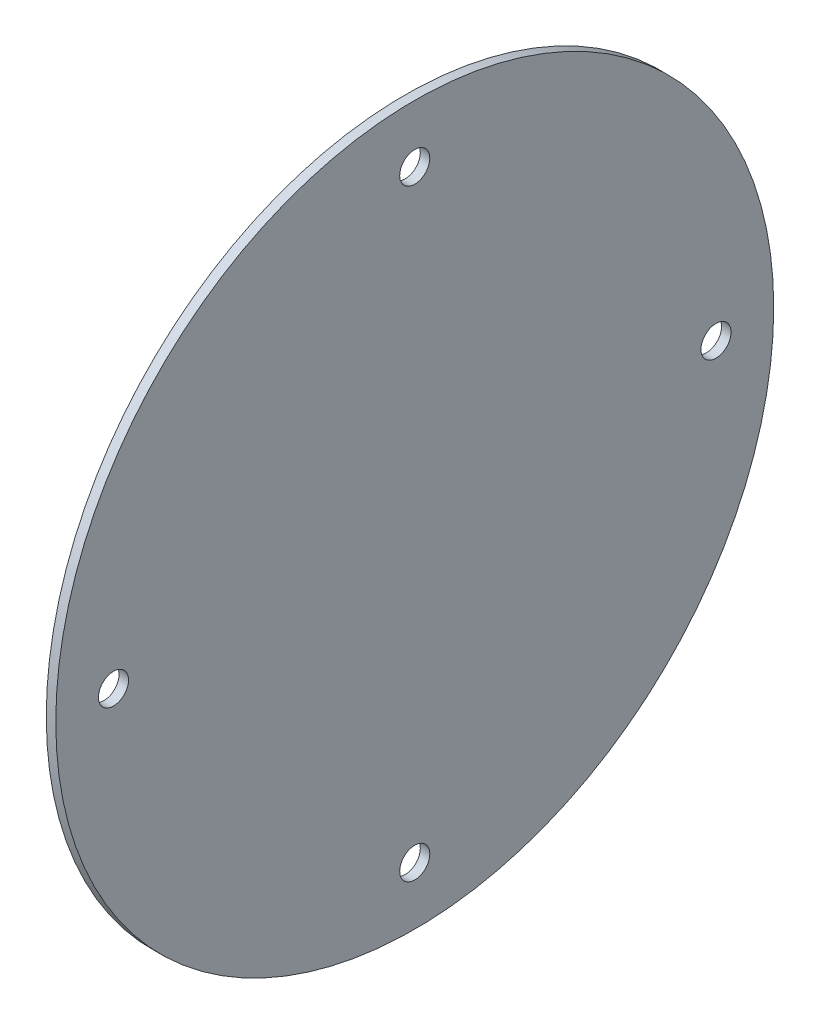
ISO-10303-21;
HEADER;
FILE_DESCRIPTION(('STEP AP214'),'2;1');
FILE_NAME('part.step','',(''),(''),'','','');
FILE_SCHEMA(('AUTOMOTIVE_DESIGN { 1 0 10303 214 1 1 1 1 }'));
ENDSEC;
DATA;
#1=APPLICATION_CONTEXT('core data for automotive mechanical design processes');
#2=APPLICATION_PROTOCOL_DEFINITION('international standard','automotive_design',2000,#1);
#3=PRODUCT_CONTEXT('',#1,'mechanical');
#4=PRODUCT('Part','Part','',(#3));
#5=PRODUCT_RELATED_PRODUCT_CATEGORY('part','',(#4));
#6=PRODUCT_DEFINITION_FORMATION('','',#4);
#7=PRODUCT_DEFINITION_CONTEXT('part definition',#1,'design');
#8=PRODUCT_DEFINITION('design','',#6,#7);
#9=PRODUCT_DEFINITION_SHAPE('','',#8);
#10=(LENGTH_UNIT() NAMED_UNIT(*) SI_UNIT(.MILLI.,.METRE.));
#11=(NAMED_UNIT(*) PLANE_ANGLE_UNIT() SI_UNIT($,.RADIAN.));
#12=(NAMED_UNIT(*) SI_UNIT($,.STERADIAN.) SOLID_ANGLE_UNIT());
#13=UNCERTAINTY_MEASURE_WITH_UNIT(LENGTH_MEASURE(1.E-05),#10,'distance_accuracy_value','');
#14=(GEOMETRIC_REPRESENTATION_CONTEXT(3) GLOBAL_UNCERTAINTY_ASSIGNED_CONTEXT((#13)) GLOBAL_UNIT_ASSIGNED_CONTEXT((#10,
#11,#12)) REPRESENTATION_CONTEXT('',''));
#15=CARTESIAN_POINT('',(0.,0.,0.));
#16=DIRECTION('',(0.,0.,1.));
#17=DIRECTION('',(1.,0.,0.));
#18=AXIS2_PLACEMENT_3D('',#15,#16,#17);
#19=CARTESIAN_POINT('',(2.0066,0.,0.));
#20=DIRECTION('',(-1.,0.,0.));
#21=DIRECTION('',(0.,0.,1.));
#22=AXIS2_PLACEMENT_3D('',#19,#20,#21);
#23=CYLINDRICAL_SURFACE('',#22,75.819);
#24=CARTESIAN_POINT('',(2.0066,0.,0.));
#25=DIRECTION('',(1.,0.,0.));
#26=DIRECTION('',(0.,0.,-1.));
#27=AXIS2_PLACEMENT_3D('',#24,#25,#26);
#28=CIRCLE('',#27,75.819);
#29=CARTESIAN_POINT('',(2.0066,0.,-75.819));
#30=VERTEX_POINT('',#29);
#31=EDGE_CURVE('E10',#30,#30,#28,.T.);
#32=ORIENTED_EDGE('',*,*,#31,.F.);
#33=EDGE_LOOP('',(#32));
#34=FACE_BOUND('',#33,.T.);
#35=CARTESIAN_POINT('',(0.,0.,0.));
#36=DIRECTION('',(1.,0.,0.));
#37=DIRECTION('',(0.,0.,-1.));
#38=AXIS2_PLACEMENT_3D('',#35,#36,#37);
#39=CIRCLE('',#38,75.819);
#40=CARTESIAN_POINT('',(0.,0.,-75.819));
#41=VERTEX_POINT('',#40);
#42=EDGE_CURVE('E45',#41,#41,#39,.T.);
#43=ORIENTED_EDGE('',*,*,#42,.T.);
#44=EDGE_LOOP('',(#43));
#45=FACE_BOUND('',#44,.T.);
#46=ADVANCED_FACE('F42',(#34,#45),#23,.T.);
#47=CARTESIAN_POINT('',(2.0066,0.,0.));
#48=DIRECTION('',(1.,0.,0.));
#49=DIRECTION('',(0.,0.,-1.));
#50=AXIS2_PLACEMENT_3D('',#47,#48,#49);
#51=PLANE('',#50);
#52=CARTESIAN_POINT('',(2.0066,-63.627,-2.23645572524093E-13));
#53=DIRECTION('',(-1.,0.,0.));
#54=DIRECTION('',(0.,-1.,0.));
#55=AXIS2_PLACEMENT_3D('',#52,#53,#54);
#56=CIRCLE('',#55,3.175);
#57=CARTESIAN_POINT('',(2.0066,-66.802,-2.34731025774919E-13));
#58=VERTEX_POINT('',#57);
#59=EDGE_CURVE('E60',#58,#58,#56,.T.);
#60=ORIENTED_EDGE('',*,*,#59,.T.);
#61=EDGE_LOOP('',(#60));
#62=FACE_BOUND('',#61,.T.);
#63=CARTESIAN_POINT('',(2.0066,0.,-63.627));
#64=DIRECTION('',(-1.,0.,0.));
#65=DIRECTION('',(0.,0.,-1.));
#66=AXIS2_PLACEMENT_3D('',#63,#64,#65);
#67=CIRCLE('',#66,3.175);
#68=CARTESIAN_POINT('',(2.0066,0.,-66.802));
#69=VERTEX_POINT('',#68);
#70=EDGE_CURVE('E76',#69,#69,#67,.T.);
#71=ORIENTED_EDGE('',*,*,#70,.T.);
#72=EDGE_LOOP('',(#71));
#73=FACE_BOUND('',#72,.T.);
#74=CARTESIAN_POINT('',(2.0066,63.627,6.67950538817237E-13));
#75=DIRECTION('',(-1.,0.,0.));
#76=DIRECTION('',(0.,1.,0.));
#77=AXIS2_PLACEMENT_3D('',#74,#75,#76);
#78=CIRCLE('',#77,3.175);
#79=CARTESIAN_POINT('',(2.0066,66.802,7.01206898569718E-13));
#80=VERTEX_POINT('',#79);
#81=EDGE_CURVE('E68',#80,#80,#78,.T.);
#82=ORIENTED_EDGE('',*,*,#81,.T.);
#83=EDGE_LOOP('',(#82));
#84=FACE_BOUND('',#83,.T.);
#85=CARTESIAN_POINT('',(2.0066,0.,63.627));
#86=DIRECTION('',(-1.,0.,0.));
#87=DIRECTION('',(0.,0.,1.));
#88=AXIS2_PLACEMENT_3D('',#85,#86,#87);
#89=CIRCLE('',#88,3.175);
#90=CARTESIAN_POINT('',(2.0066,0.,66.802));
#91=VERTEX_POINT('',#90);
#92=EDGE_CURVE('E54',#91,#91,#89,.T.);
#93=ORIENTED_EDGE('',*,*,#92,.T.);
#94=EDGE_LOOP('',(#93));
#95=FACE_BOUND('',#94,.T.);
#96=ORIENTED_EDGE('',*,*,#31,.T.);
#97=EDGE_LOOP('',(#96));
#98=FACE_BOUND('',#97,.T.);
#99=ADVANCED_FACE('F88',(#62,#73,#84,#95,#98),#51,.T.);
#100=CARTESIAN_POINT('',(0.,0.,0.));
#101=DIRECTION('',(1.,0.,0.));
#102=DIRECTION('',(0.,0.,-1.));
#103=AXIS2_PLACEMENT_3D('',#100,#101,#102);
#104=PLANE('',#103);
#105=CARTESIAN_POINT('',(0.,-63.627,-2.23645572524093E-13));
#106=DIRECTION('',(-1.,0.,0.));
#107=DIRECTION('',(0.,-1.,0.));
#108=AXIS2_PLACEMENT_3D('',#105,#106,#107);
#109=CIRCLE('',#108,3.175);
#110=CARTESIAN_POINT('',(0.,-66.802,-2.34731025774919E-13));
#111=VERTEX_POINT('',#110);
#112=EDGE_CURVE('E80',#111,#111,#109,.T.);
#113=ORIENTED_EDGE('',*,*,#112,.F.);
#114=EDGE_LOOP('',(#113));
#115=FACE_BOUND('',#114,.T.);
#116=CARTESIAN_POINT('',(0.,0.,-63.627));
#117=DIRECTION('',(-1.,0.,0.));
#118=DIRECTION('',(0.,0.,-1.));
#119=AXIS2_PLACEMENT_3D('',#116,#117,#118);
#120=CIRCLE('',#119,3.175);
#121=CARTESIAN_POINT('',(0.,0.,-66.802));
#122=VERTEX_POINT('',#121);
#123=EDGE_CURVE('E72',#122,#122,#120,.T.);
#124=ORIENTED_EDGE('',*,*,#123,.F.);
#125=EDGE_LOOP('',(#124));
#126=FACE_BOUND('',#125,.T.);
#127=CARTESIAN_POINT('',(0.,63.627,6.67950538817237E-13));
#128=DIRECTION('',(-1.,0.,0.));
#129=DIRECTION('',(0.,1.,0.));
#130=AXIS2_PLACEMENT_3D('',#127,#128,#129);
#131=CIRCLE('',#130,3.175);
#132=CARTESIAN_POINT('',(0.,66.802,7.01206898569718E-13));
#133=VERTEX_POINT('',#132);
#134=EDGE_CURVE('E64',#133,#133,#131,.T.);
#135=ORIENTED_EDGE('',*,*,#134,.F.);
#136=EDGE_LOOP('',(#135));
#137=FACE_BOUND('',#136,.T.);
#138=CARTESIAN_POINT('',(0.,0.,63.627));
#139=DIRECTION('',(-1.,0.,0.));
#140=DIRECTION('',(0.,0.,1.));
#141=AXIS2_PLACEMENT_3D('',#138,#139,#140);
#142=CIRCLE('',#141,3.175);
#143=CARTESIAN_POINT('',(0.,0.,66.802));
#144=VERTEX_POINT('',#143);
#145=EDGE_CURVE('E56',#144,#144,#142,.T.);
#146=ORIENTED_EDGE('',*,*,#145,.F.);
#147=EDGE_LOOP('',(#146));
#148=FACE_BOUND('',#147,.T.);
#149=ORIENTED_EDGE('',*,*,#42,.F.);
#150=EDGE_LOOP('',(#149));
#151=FACE_BOUND('',#150,.T.);
#152=ADVANCED_FACE('F98',(#115,#126,#137,#148,#151),#104,.F.);
#153=CARTESIAN_POINT('',(2.0066,0.,63.627));
#154=DIRECTION('',(-1.,0.,0.));
#155=DIRECTION('',(0.,0.,1.));
#156=AXIS2_PLACEMENT_3D('',#153,#154,#155);
#157=CYLINDRICAL_SURFACE('',#156,3.175);
#158=ORIENTED_EDGE('',*,*,#92,.F.);
#159=EDGE_LOOP('',(#158));
#160=FACE_BOUND('',#159,.T.);
#161=ORIENTED_EDGE('',*,*,#145,.T.);
#162=EDGE_LOOP('',(#161));
#163=FACE_BOUND('',#162,.T.);
#164=ADVANCED_FACE('F101',(#160,#163),#157,.F.);
#165=CARTESIAN_POINT('',(2.0066,63.627,6.67950538817237E-13));
#166=DIRECTION('',(-1.,0.,0.));
#167=DIRECTION('',(0.,0.,1.));
#168=AXIS2_PLACEMENT_3D('',#165,#166,#167);
#169=CYLINDRICAL_SURFACE('',#168,3.175);
#170=ORIENTED_EDGE('',*,*,#81,.F.);
#171=EDGE_LOOP('',(#170));
#172=FACE_BOUND('',#171,.T.);
#173=ORIENTED_EDGE('',*,*,#134,.T.);
#174=EDGE_LOOP('',(#173));
#175=FACE_BOUND('',#174,.T.);
#176=ADVANCED_FACE('F121',(#172,#175),#169,.F.);
#177=CARTESIAN_POINT('',(2.0066,0.,-63.627));
#178=DIRECTION('',(-1.,0.,0.));
#179=DIRECTION('',(0.,0.,1.));
#180=AXIS2_PLACEMENT_3D('',#177,#178,#179);
#181=CYLINDRICAL_SURFACE('',#180,3.175);
#182=ORIENTED_EDGE('',*,*,#70,.F.);
#183=EDGE_LOOP('',(#182));
#184=FACE_BOUND('',#183,.T.);
#185=ORIENTED_EDGE('',*,*,#123,.T.);
#186=EDGE_LOOP('',(#185));
#187=FACE_BOUND('',#186,.T.);
#188=ADVANCED_FACE('F94',(#184,#187),#181,.F.);
#189=CARTESIAN_POINT('',(2.0066,-63.627,-2.23645572524093E-13));
#190=DIRECTION('',(-1.,0.,0.));
#191=DIRECTION('',(0.,0.,1.));
#192=AXIS2_PLACEMENT_3D('',#189,#190,#191);
#193=CYLINDRICAL_SURFACE('',#192,3.175);
#194=ORIENTED_EDGE('',*,*,#59,.F.);
#195=EDGE_LOOP('',(#194));
#196=FACE_BOUND('',#195,.T.);
#197=ORIENTED_EDGE('',*,*,#112,.T.);
#198=EDGE_LOOP('',(#197));
#199=FACE_BOUND('',#198,.T.);
#200=ADVANCED_FACE('F91',(#196,#199),#193,.F.);
#201=CLOSED_SHELL('',(#46,#99,#152,#164,#176,#188,#200));
#202=MANIFOLD_SOLID_BREP('B2',#201);
#203=ADVANCED_BREP_SHAPE_REPRESENTATION('',(#18,#202),#14);
#204=SHAPE_DEFINITION_REPRESENTATION(#9,#203);
ENDSEC;
END-ISO-10303-21;
